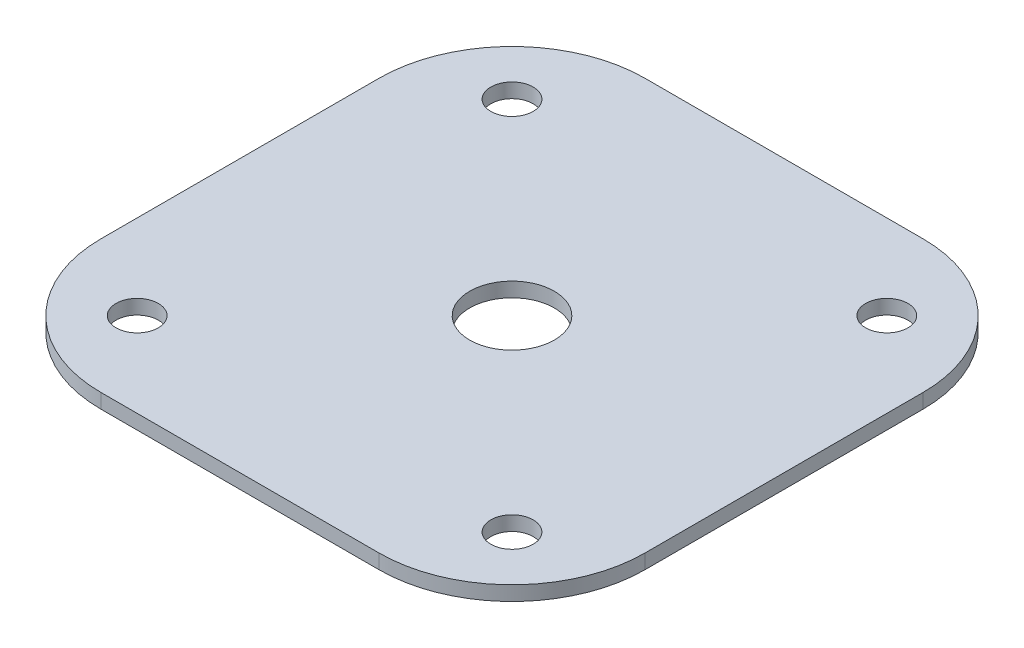
ISO-10303-21;
HEADER;
FILE_DESCRIPTION(('STEP AP214'),'2;1');
FILE_NAME('part.step','',(''),(''),'','','');
FILE_SCHEMA(('AUTOMOTIVE_DESIGN { 1 0 10303 214 1 1 1 1 }'));
ENDSEC;
DATA;
#1=APPLICATION_CONTEXT('core data for automotive mechanical design processes');
#2=APPLICATION_PROTOCOL_DEFINITION('international standard','automotive_design',2000,#1);
#3=PRODUCT_CONTEXT('',#1,'mechanical');
#4=PRODUCT('Part','Part','',(#3));
#5=PRODUCT_RELATED_PRODUCT_CATEGORY('part','',(#4));
#6=PRODUCT_DEFINITION_FORMATION('','',#4);
#7=PRODUCT_DEFINITION_CONTEXT('part definition',#1,'design');
#8=PRODUCT_DEFINITION('design','',#6,#7);
#9=PRODUCT_DEFINITION_SHAPE('','',#8);
#10=(LENGTH_UNIT() NAMED_UNIT(*) SI_UNIT(.MILLI.,.METRE.));
#11=(NAMED_UNIT(*) PLANE_ANGLE_UNIT() SI_UNIT($,.RADIAN.));
#12=(NAMED_UNIT(*) SI_UNIT($,.STERADIAN.) SOLID_ANGLE_UNIT());
#13=UNCERTAINTY_MEASURE_WITH_UNIT(LENGTH_MEASURE(1.E-05),#10,'distance_accuracy_value','');
#14=(GEOMETRIC_REPRESENTATION_CONTEXT(3) GLOBAL_UNCERTAINTY_ASSIGNED_CONTEXT((#13)) GLOBAL_UNIT_ASSIGNED_CONTEXT((#10,
#11,#12)) REPRESENTATION_CONTEXT('',''));
#15=CARTESIAN_POINT('',(0.,0.,0.));
#16=DIRECTION('',(0.,0.,1.));
#17=DIRECTION('',(1.,0.,0.));
#18=AXIS2_PLACEMENT_3D('',#15,#16,#17);
#19=CARTESIAN_POINT('',(-11.5,1.2,11.5));
#20=DIRECTION('',(0.,1.,0.));
#21=DIRECTION('',(0.,0.,1.));
#22=AXIS2_PLACEMENT_3D('',#19,#20,#21);
#23=PLANE('',#22);
#24=CARTESIAN_POINT('',(15.5,1.2,15.5));
#25=DIRECTION('',(0.,1.,0.));
#26=DIRECTION('',(0.,0.,-1.));
#27=AXIS2_PLACEMENT_3D('',#24,#25,#26);
#28=CIRCLE('',#27,1.75);
#29=CARTESIAN_POINT('',(15.5,1.2,13.75));
#30=VERTEX_POINT('',#29);
#31=EDGE_CURVE('E198',#30,#30,#28,.T.);
#32=ORIENTED_EDGE('',*,*,#31,.F.);
#33=EDGE_LOOP('',(#32));
#34=FACE_BOUND('',#33,.T.);
#35=CARTESIAN_POINT('',(-15.5,1.2,-15.5));
#36=DIRECTION('',(0.,1.,0.));
#37=DIRECTION('',(0.,0.,1.));
#38=AXIS2_PLACEMENT_3D('',#35,#36,#37);
#39=CIRCLE('',#38,1.75);
#40=CARTESIAN_POINT('',(-15.5,1.2,-13.75));
#41=VERTEX_POINT('',#40);
#42=EDGE_CURVE('E186',#41,#41,#39,.T.);
#43=ORIENTED_EDGE('',*,*,#42,.F.);
#44=EDGE_LOOP('',(#43));
#45=FACE_BOUND('',#44,.T.);
#46=CARTESIAN_POINT('',(-11.5,1.2,11.5));
#47=DIRECTION('',(0.,1.,0.));
#48=DIRECTION('',(0.,0.,1.));
#49=AXIS2_PLACEMENT_3D('',#46,#47,#48);
#50=CIRCLE('',#49,11.);
#51=CARTESIAN_POINT('',(-22.5,1.2,11.5));
#52=VERTEX_POINT('',#51);
#53=CARTESIAN_POINT('',(-11.5,1.2,22.5));
#54=VERTEX_POINT('',#53);
#55=EDGE_CURVE('E149',#52,#54,#50,.T.);
#56=ORIENTED_EDGE('',*,*,#55,.T.);
#57=DIRECTION('',(1.,0.,0.));
#58=VECTOR('',#57,1.);
#59=CARTESIAN_POINT('',(-11.5,1.2,22.5));
#60=LINE('',#59,#58);
#61=CARTESIAN_POINT('',(11.5,1.2,22.5));
#62=VERTEX_POINT('',#61);
#63=EDGE_CURVE('E97',#54,#62,#60,.T.);
#64=ORIENTED_EDGE('',*,*,#63,.T.);
#65=CARTESIAN_POINT('',(11.5,1.2,11.5));
#66=DIRECTION('',(0.,1.,0.));
#67=DIRECTION('',(0.,0.,1.));
#68=AXIS2_PLACEMENT_3D('',#65,#66,#67);
#69=CIRCLE('',#68,11.);
#70=CARTESIAN_POINT('',(22.5,1.2,11.5));
#71=VERTEX_POINT('',#70);
#72=EDGE_CURVE('E164',#62,#71,#69,.T.);
#73=ORIENTED_EDGE('',*,*,#72,.T.);
#74=DIRECTION('',(0.,0.,-1.));
#75=VECTOR('',#74,1.);
#76=CARTESIAN_POINT('',(22.5,1.2,-11.5));
#77=LINE('',#76,#75);
#78=CARTESIAN_POINT('',(22.5,1.2,-11.5));
#79=VERTEX_POINT('',#78);
#80=EDGE_CURVE('E177',#71,#79,#77,.T.);
#81=ORIENTED_EDGE('',*,*,#80,.T.);
#82=CARTESIAN_POINT('',(11.5,1.2,-11.5));
#83=DIRECTION('',(0.,1.,0.));
#84=DIRECTION('',(0.,0.,-1.));
#85=AXIS2_PLACEMENT_3D('',#82,#83,#84);
#86=CIRCLE('',#85,11.);
#87=CARTESIAN_POINT('',(11.5,1.2,-22.5));
#88=VERTEX_POINT('',#87);
#89=EDGE_CURVE('E116',#79,#88,#86,.T.);
#90=ORIENTED_EDGE('',*,*,#89,.T.);
#91=DIRECTION('',(-1.,0.,0.));
#92=VECTOR('',#91,1.);
#93=CARTESIAN_POINT('',(-11.5,1.2,-22.5));
#94=LINE('',#93,#92);
#95=CARTESIAN_POINT('',(-11.5,1.2,-22.5));
#96=VERTEX_POINT('',#95);
#97=EDGE_CURVE('E110',#88,#96,#94,.T.);
#98=ORIENTED_EDGE('',*,*,#97,.T.);
#99=CARTESIAN_POINT('',(-11.5,1.2,-11.5));
#100=DIRECTION('',(0.,1.,0.));
#101=DIRECTION('',(0.,0.,1.));
#102=AXIS2_PLACEMENT_3D('',#99,#100,#101);
#103=CIRCLE('',#102,11.);
#104=CARTESIAN_POINT('',(-22.5,1.2,-11.5));
#105=VERTEX_POINT('',#104);
#106=EDGE_CURVE('E114',#96,#105,#103,.T.);
#107=ORIENTED_EDGE('',*,*,#106,.T.);
#108=DIRECTION('',(0.,0.,1.));
#109=VECTOR('',#108,1.);
#110=CARTESIAN_POINT('',(-22.5,1.2,-11.5));
#111=LINE('',#110,#109);
#112=EDGE_CURVE('E54',#105,#52,#111,.T.);
#113=ORIENTED_EDGE('',*,*,#112,.T.);
#114=EDGE_LOOP('',(#56,#64,#73,#81,#90,#98,#107,#113));
#115=FACE_BOUND('',#114,.T.);
#116=CARTESIAN_POINT('',(0.,1.2,0.));
#117=DIRECTION('',(0.,1.,0.));
#118=DIRECTION('',(0.,0.,1.));
#119=AXIS2_PLACEMENT_3D('',#116,#117,#118);
#120=CIRCLE('',#119,3.5);
#121=CARTESIAN_POINT('',(0.,1.2,3.5));
#122=VERTEX_POINT('',#121);
#123=EDGE_CURVE('E138',#122,#122,#120,.T.);
#124=ORIENTED_EDGE('',*,*,#123,.F.);
#125=EDGE_LOOP('',(#124));
#126=FACE_BOUND('',#125,.T.);
#127=CARTESIAN_POINT('',(15.5,1.2,-15.5));
#128=DIRECTION('',(0.,1.,0.));
#129=DIRECTION('',(0.,0.,1.));
#130=AXIS2_PLACEMENT_3D('',#127,#128,#129);
#131=CIRCLE('',#130,1.75);
#132=CARTESIAN_POINT('',(15.5,1.2,-13.75));
#133=VERTEX_POINT('',#132);
#134=EDGE_CURVE('E192',#133,#133,#131,.T.);
#135=ORIENTED_EDGE('',*,*,#134,.F.);
#136=EDGE_LOOP('',(#135));
#137=FACE_BOUND('',#136,.T.);
#138=CARTESIAN_POINT('',(-15.5,1.2,15.5));
#139=DIRECTION('',(0.,1.,0.));
#140=DIRECTION('',(0.,0.,-1.));
#141=AXIS2_PLACEMENT_3D('',#138,#139,#140);
#142=CIRCLE('',#141,1.75);
#143=CARTESIAN_POINT('',(-15.5,1.2,13.75));
#144=VERTEX_POINT('',#143);
#145=EDGE_CURVE('E204',#144,#144,#142,.T.);
#146=ORIENTED_EDGE('',*,*,#145,.F.);
#147=EDGE_LOOP('',(#146));
#148=FACE_BOUND('',#147,.T.);
#149=ADVANCED_FACE('F37',(#34,#45,#115,#126,#137,#148),#23,.T.);
#150=CARTESIAN_POINT('',(-11.5,0.,11.5));
#151=DIRECTION('',(0.,1.,0.));
#152=DIRECTION('',(0.,0.,1.));
#153=AXIS2_PLACEMENT_3D('',#150,#151,#152);
#154=PLANE('',#153);
#155=CARTESIAN_POINT('',(-11.5,0.,11.5));
#156=DIRECTION('',(0.,1.,0.));
#157=DIRECTION('',(0.,0.,1.));
#158=AXIS2_PLACEMENT_3D('',#155,#156,#157);
#159=CIRCLE('',#158,11.);
#160=CARTESIAN_POINT('',(-22.5,0.,11.5));
#161=VERTEX_POINT('',#160);
#162=CARTESIAN_POINT('',(-11.5,0.,22.5));
#163=VERTEX_POINT('',#162);
#164=EDGE_CURVE('E134',#161,#163,#159,.T.);
#165=ORIENTED_EDGE('',*,*,#164,.F.);
#166=DIRECTION('',(0.,0.,1.));
#167=VECTOR('',#166,1.);
#168=CARTESIAN_POINT('',(-22.5,0.,-11.5));
#169=LINE('',#168,#167);
#170=CARTESIAN_POINT('',(-22.5,0.,-11.5));
#171=VERTEX_POINT('',#170);
#172=EDGE_CURVE('E89',#171,#161,#169,.T.);
#173=ORIENTED_EDGE('',*,*,#172,.F.);
#174=CARTESIAN_POINT('',(-11.5,0.,-11.5));
#175=DIRECTION('',(0.,1.,0.));
#176=DIRECTION('',(0.,0.,1.));
#177=AXIS2_PLACEMENT_3D('',#174,#175,#176);
#178=CIRCLE('',#177,11.);
#179=CARTESIAN_POINT('',(-11.5,0.,-22.5));
#180=VERTEX_POINT('',#179);
#181=EDGE_CURVE('E83',#180,#171,#178,.T.);
#182=ORIENTED_EDGE('',*,*,#181,.F.);
#183=DIRECTION('',(-1.,0.,0.));
#184=VECTOR('',#183,1.);
#185=CARTESIAN_POINT('',(-11.5,0.,-22.5));
#186=LINE('',#185,#184);
#187=CARTESIAN_POINT('',(11.5,0.,-22.5));
#188=VERTEX_POINT('',#187);
#189=EDGE_CURVE('E124',#188,#180,#186,.T.);
#190=ORIENTED_EDGE('',*,*,#189,.F.);
#191=CARTESIAN_POINT('',(11.5,0.,-11.5));
#192=DIRECTION('',(0.,1.,0.));
#193=DIRECTION('',(0.,0.,-1.));
#194=AXIS2_PLACEMENT_3D('',#191,#192,#193);
#195=CIRCLE('',#194,11.);
#196=CARTESIAN_POINT('',(22.5,0.,-11.5));
#197=VERTEX_POINT('',#196);
#198=EDGE_CURVE('E144',#197,#188,#195,.T.);
#199=ORIENTED_EDGE('',*,*,#198,.F.);
#200=DIRECTION('',(0.,0.,-1.));
#201=VECTOR('',#200,1.);
#202=CARTESIAN_POINT('',(22.5,0.,-11.5));
#203=LINE('',#202,#201);
#204=CARTESIAN_POINT('',(22.5,0.,11.5));
#205=VERTEX_POINT('',#204);
#206=EDGE_CURVE('E142',#205,#197,#203,.T.);
#207=ORIENTED_EDGE('',*,*,#206,.F.);
#208=CARTESIAN_POINT('',(11.5,0.,11.5));
#209=DIRECTION('',(0.,1.,0.));
#210=DIRECTION('',(0.,0.,1.));
#211=AXIS2_PLACEMENT_3D('',#208,#209,#210);
#212=CIRCLE('',#211,11.);
#213=CARTESIAN_POINT('',(11.5,0.,22.5));
#214=VERTEX_POINT('',#213);
#215=EDGE_CURVE('E140',#214,#205,#212,.T.);
#216=ORIENTED_EDGE('',*,*,#215,.F.);
#217=DIRECTION('',(1.,0.,0.));
#218=VECTOR('',#217,1.);
#219=CARTESIAN_POINT('',(-11.5,0.,22.5));
#220=LINE('',#219,#218);
#221=EDGE_CURVE('E137',#163,#214,#220,.T.);
#222=ORIENTED_EDGE('',*,*,#221,.F.);
#223=EDGE_LOOP('',(#165,#173,#182,#190,#199,#207,#216,#222));
#224=FACE_BOUND('',#223,.T.);
#225=CARTESIAN_POINT('',(0.,0.,0.));
#226=DIRECTION('',(0.,1.,0.));
#227=DIRECTION('',(0.,0.,1.));
#228=AXIS2_PLACEMENT_3D('',#225,#226,#227);
#229=CIRCLE('',#228,3.5);
#230=CARTESIAN_POINT('',(0.,0.,3.5));
#231=VERTEX_POINT('',#230);
#232=EDGE_CURVE('E183',#231,#231,#229,.T.);
#233=ORIENTED_EDGE('',*,*,#232,.T.);
#234=EDGE_LOOP('',(#233));
#235=FACE_BOUND('',#234,.T.);
#236=CARTESIAN_POINT('',(-15.5,0.,-15.5));
#237=DIRECTION('',(0.,1.,0.));
#238=DIRECTION('',(0.,0.,1.));
#239=AXIS2_PLACEMENT_3D('',#236,#237,#238);
#240=CIRCLE('',#239,1.75);
#241=CARTESIAN_POINT('',(-15.5,0.,-13.75));
#242=VERTEX_POINT('',#241);
#243=EDGE_CURVE('E189',#242,#242,#240,.T.);
#244=ORIENTED_EDGE('',*,*,#243,.T.);
#245=EDGE_LOOP('',(#244));
#246=FACE_BOUND('',#245,.T.);
#247=CARTESIAN_POINT('',(15.5,0.,-15.5));
#248=DIRECTION('',(0.,1.,0.));
#249=DIRECTION('',(0.,0.,1.));
#250=AXIS2_PLACEMENT_3D('',#247,#248,#249);
#251=CIRCLE('',#250,1.75);
#252=CARTESIAN_POINT('',(15.5,0.,-13.75));
#253=VERTEX_POINT('',#252);
#254=EDGE_CURVE('E195',#253,#253,#251,.T.);
#255=ORIENTED_EDGE('',*,*,#254,.T.);
#256=EDGE_LOOP('',(#255));
#257=FACE_BOUND('',#256,.T.);
#258=CARTESIAN_POINT('',(15.5,0.,15.5));
#259=DIRECTION('',(0.,1.,0.));
#260=DIRECTION('',(0.,0.,-1.));
#261=AXIS2_PLACEMENT_3D('',#258,#259,#260);
#262=CIRCLE('',#261,1.75);
#263=CARTESIAN_POINT('',(15.5,0.,13.75));
#264=VERTEX_POINT('',#263);
#265=EDGE_CURVE('E201',#264,#264,#262,.T.);
#266=ORIENTED_EDGE('',*,*,#265,.T.);
#267=EDGE_LOOP('',(#266));
#268=FACE_BOUND('',#267,.T.);
#269=CARTESIAN_POINT('',(-15.5,0.,15.5));
#270=DIRECTION('',(0.,1.,0.));
#271=DIRECTION('',(0.,0.,-1.));
#272=AXIS2_PLACEMENT_3D('',#269,#270,#271);
#273=CIRCLE('',#272,1.75);
#274=CARTESIAN_POINT('',(-15.5,0.,13.75));
#275=VERTEX_POINT('',#274);
#276=EDGE_CURVE('E207',#275,#275,#273,.T.);
#277=ORIENTED_EDGE('',*,*,#276,.T.);
#278=EDGE_LOOP('',(#277));
#279=FACE_BOUND('',#278,.T.);
#280=ADVANCED_FACE('F168',(#224,#235,#246,#257,#268,#279),#154,.F.);
#281=CARTESIAN_POINT('',(-11.5,1.2,11.5));
#282=DIRECTION('',(0.,-1.,0.));
#283=DIRECTION('',(0.,0.,-1.));
#284=AXIS2_PLACEMENT_3D('',#281,#282,#283);
#285=CYLINDRICAL_SURFACE('',#284,11.);
#286=ORIENTED_EDGE('',*,*,#164,.T.);
#287=DIRECTION('',(0.,-1.,0.));
#288=VECTOR('',#287,1.);
#289=CARTESIAN_POINT('',(-11.5,1.2,22.5));
#290=LINE('',#289,#288);
#291=EDGE_CURVE('E11',#54,#163,#290,.T.);
#292=ORIENTED_EDGE('',*,*,#291,.F.);
#293=ORIENTED_EDGE('',*,*,#55,.F.);
#294=DIRECTION('',(0.,-1.,0.));
#295=VECTOR('',#294,1.);
#296=CARTESIAN_POINT('',(-22.5,1.2,11.5));
#297=LINE('',#296,#295);
#298=EDGE_CURVE('E130',#52,#161,#297,.T.);
#299=ORIENTED_EDGE('',*,*,#298,.T.);
#300=EDGE_LOOP('',(#286,#292,#293,#299));
#301=FACE_BOUND('',#300,.T.);
#302=ADVANCED_FACE('F39',(#301),#285,.T.);
#303=CARTESIAN_POINT('',(-11.5,1.2,22.5));
#304=DIRECTION('',(0.,0.,-1.));
#305=DIRECTION('',(-1.,0.,0.));
#306=AXIS2_PLACEMENT_3D('',#303,#304,#305);
#307=PLANE('',#306);
#308=ORIENTED_EDGE('',*,*,#221,.T.);
#309=DIRECTION('',(0.,-1.,0.));
#310=VECTOR('',#309,1.);
#311=CARTESIAN_POINT('',(11.5,1.2,22.5));
#312=LINE('',#311,#310);
#313=EDGE_CURVE('E46',#62,#214,#312,.T.);
#314=ORIENTED_EDGE('',*,*,#313,.F.);
#315=ORIENTED_EDGE('',*,*,#63,.F.);
#316=ORIENTED_EDGE('',*,*,#291,.T.);
#317=EDGE_LOOP('',(#308,#314,#315,#316));
#318=FACE_BOUND('',#317,.T.);
#319=ADVANCED_FACE('F241',(#318),#307,.F.);
#320=CARTESIAN_POINT('',(11.5,1.2,11.5));
#321=DIRECTION('',(0.,-1.,0.));
#322=DIRECTION('',(0.,0.,-1.));
#323=AXIS2_PLACEMENT_3D('',#320,#321,#322);
#324=CYLINDRICAL_SURFACE('',#323,11.);
#325=ORIENTED_EDGE('',*,*,#215,.T.);
#326=DIRECTION('',(0.,-1.,0.));
#327=VECTOR('',#326,1.);
#328=CARTESIAN_POINT('',(22.5,1.2,11.5));
#329=LINE('',#328,#327);
#330=EDGE_CURVE('E156',#71,#205,#329,.T.);
#331=ORIENTED_EDGE('',*,*,#330,.F.);
#332=ORIENTED_EDGE('',*,*,#72,.F.);
#333=ORIENTED_EDGE('',*,*,#313,.T.);
#334=EDGE_LOOP('',(#325,#331,#332,#333));
#335=FACE_BOUND('',#334,.T.);
#336=ADVANCED_FACE('F162',(#335),#324,.T.);
#337=CARTESIAN_POINT('',(22.5,1.2,-11.5));
#338=DIRECTION('',(-1.,0.,0.));
#339=DIRECTION('',(0.,0.,1.));
#340=AXIS2_PLACEMENT_3D('',#337,#338,#339);
#341=PLANE('',#340);
#342=ORIENTED_EDGE('',*,*,#206,.T.);
#343=DIRECTION('',(0.,-1.,0.));
#344=VECTOR('',#343,1.);
#345=CARTESIAN_POINT('',(22.5,1.2,-11.5));
#346=LINE('',#345,#344);
#347=EDGE_CURVE('E153',#79,#197,#346,.T.);
#348=ORIENTED_EDGE('',*,*,#347,.F.);
#349=ORIENTED_EDGE('',*,*,#80,.F.);
#350=ORIENTED_EDGE('',*,*,#330,.T.);
#351=EDGE_LOOP('',(#342,#348,#349,#350));
#352=FACE_BOUND('',#351,.T.);
#353=ADVANCED_FACE('F173',(#352),#341,.F.);
#354=CARTESIAN_POINT('',(11.5,1.2,-11.5));
#355=DIRECTION('',(0.,-1.,0.));
#356=DIRECTION('',(0.,0.,-1.));
#357=AXIS2_PLACEMENT_3D('',#354,#355,#356);
#358=CYLINDRICAL_SURFACE('',#357,11.);
#359=ORIENTED_EDGE('',*,*,#198,.T.);
#360=DIRECTION('',(0.,-1.,0.));
#361=VECTOR('',#360,1.);
#362=CARTESIAN_POINT('',(11.5,1.2,-22.5));
#363=LINE('',#362,#361);
#364=EDGE_CURVE('E125',#88,#188,#363,.T.);
#365=ORIENTED_EDGE('',*,*,#364,.F.);
#366=ORIENTED_EDGE('',*,*,#89,.F.);
#367=ORIENTED_EDGE('',*,*,#347,.T.);
#368=EDGE_LOOP('',(#359,#365,#366,#367));
#369=FACE_BOUND('',#368,.T.);
#370=ADVANCED_FACE('F176',(#369),#358,.T.);
#371=CARTESIAN_POINT('',(-11.5,1.2,-22.5));
#372=DIRECTION('',(0.,0.,1.));
#373=DIRECTION('',(1.,0.,0.));
#374=AXIS2_PLACEMENT_3D('',#371,#372,#373);
#375=PLANE('',#374);
#376=ORIENTED_EDGE('',*,*,#189,.T.);
#377=DIRECTION('',(0.,-1.,0.));
#378=VECTOR('',#377,1.);
#379=CARTESIAN_POINT('',(-11.5,1.2,-22.5));
#380=LINE('',#379,#378);
#381=EDGE_CURVE('E121',#96,#180,#380,.T.);
#382=ORIENTED_EDGE('',*,*,#381,.F.);
#383=ORIENTED_EDGE('',*,*,#97,.F.);
#384=ORIENTED_EDGE('',*,*,#364,.T.);
#385=EDGE_LOOP('',(#376,#382,#383,#384));
#386=FACE_BOUND('',#385,.T.);
#387=ADVANCED_FACE('F122',(#386),#375,.F.);
#388=CARTESIAN_POINT('',(-11.5,1.2,-11.5));
#389=DIRECTION('',(0.,-1.,0.));
#390=DIRECTION('',(0.,0.,-1.));
#391=AXIS2_PLACEMENT_3D('',#388,#389,#390);
#392=CYLINDRICAL_SURFACE('',#391,11.);
#393=ORIENTED_EDGE('',*,*,#181,.T.);
#394=DIRECTION('',(0.,-1.,0.));
#395=VECTOR('',#394,1.);
#396=CARTESIAN_POINT('',(-22.5,1.2,-11.5));
#397=LINE('',#396,#395);
#398=EDGE_CURVE('E126',#105,#171,#397,.T.);
#399=ORIENTED_EDGE('',*,*,#398,.F.);
#400=ORIENTED_EDGE('',*,*,#106,.F.);
#401=ORIENTED_EDGE('',*,*,#381,.T.);
#402=EDGE_LOOP('',(#393,#399,#400,#401));
#403=FACE_BOUND('',#402,.T.);
#404=ADVANCED_FACE('F128',(#403),#392,.T.);
#405=CARTESIAN_POINT('',(-22.5,1.2,-11.5));
#406=DIRECTION('',(1.,0.,0.));
#407=DIRECTION('',(0.,0.,-1.));
#408=AXIS2_PLACEMENT_3D('',#405,#406,#407);
#409=PLANE('',#408);
#410=ORIENTED_EDGE('',*,*,#172,.T.);
#411=ORIENTED_EDGE('',*,*,#298,.F.);
#412=ORIENTED_EDGE('',*,*,#112,.F.);
#413=ORIENTED_EDGE('',*,*,#398,.T.);
#414=EDGE_LOOP('',(#410,#411,#412,#413));
#415=FACE_BOUND('',#414,.T.);
#416=ADVANCED_FACE('F229',(#415),#409,.F.);
#417=CARTESIAN_POINT('',(0.,1.2,0.));
#418=DIRECTION('',(0.,-1.,0.));
#419=DIRECTION('',(0.,0.,-1.));
#420=AXIS2_PLACEMENT_3D('',#417,#418,#419);
#421=CYLINDRICAL_SURFACE('',#420,3.5);
#422=ORIENTED_EDGE('',*,*,#123,.T.);
#423=EDGE_LOOP('',(#422));
#424=FACE_BOUND('',#423,.T.);
#425=ORIENTED_EDGE('',*,*,#232,.F.);
#426=EDGE_LOOP('',(#425));
#427=FACE_BOUND('',#426,.T.);
#428=ADVANCED_FACE('F226',(#424,#427),#421,.F.);
#429=CARTESIAN_POINT('',(-15.5,1.2,-15.5));
#430=DIRECTION('',(0.,-1.,0.));
#431=DIRECTION('',(0.,0.,-1.));
#432=AXIS2_PLACEMENT_3D('',#429,#430,#431);
#433=CYLINDRICAL_SURFACE('',#432,1.75);
#434=ORIENTED_EDGE('',*,*,#42,.T.);
#435=EDGE_LOOP('',(#434));
#436=FACE_BOUND('',#435,.T.);
#437=ORIENTED_EDGE('',*,*,#243,.F.);
#438=EDGE_LOOP('',(#437));
#439=FACE_BOUND('',#438,.T.);
#440=ADVANCED_FACE('F305',(#436,#439),#433,.F.);
#441=CARTESIAN_POINT('',(15.5,1.2,-15.5));
#442=DIRECTION('',(0.,-1.,0.));
#443=DIRECTION('',(0.,0.,-1.));
#444=AXIS2_PLACEMENT_3D('',#441,#442,#443);
#445=CYLINDRICAL_SURFACE('',#444,1.75);
#446=ORIENTED_EDGE('',*,*,#134,.T.);
#447=EDGE_LOOP('',(#446));
#448=FACE_BOUND('',#447,.T.);
#449=ORIENTED_EDGE('',*,*,#254,.F.);
#450=EDGE_LOOP('',(#449));
#451=FACE_BOUND('',#450,.T.);
#452=ADVANCED_FACE('F313',(#448,#451),#445,.F.);
#453=CARTESIAN_POINT('',(15.5,1.2,15.5));
#454=DIRECTION('',(0.,-1.,0.));
#455=DIRECTION('',(0.,0.,-1.));
#456=AXIS2_PLACEMENT_3D('',#453,#454,#455);
#457=CYLINDRICAL_SURFACE('',#456,1.75);
#458=ORIENTED_EDGE('',*,*,#31,.T.);
#459=EDGE_LOOP('',(#458));
#460=FACE_BOUND('',#459,.T.);
#461=ORIENTED_EDGE('',*,*,#265,.F.);
#462=EDGE_LOOP('',(#461));
#463=FACE_BOUND('',#462,.T.);
#464=ADVANCED_FACE('F321',(#460,#463),#457,.F.);
#465=CARTESIAN_POINT('',(-15.5,1.2,15.5));
#466=DIRECTION('',(0.,-1.,0.));
#467=DIRECTION('',(0.,0.,-1.));
#468=AXIS2_PLACEMENT_3D('',#465,#466,#467);
#469=CYLINDRICAL_SURFACE('',#468,1.75);
#470=ORIENTED_EDGE('',*,*,#145,.T.);
#471=EDGE_LOOP('',(#470));
#472=FACE_BOUND('',#471,.T.);
#473=ORIENTED_EDGE('',*,*,#276,.F.);
#474=EDGE_LOOP('',(#473));
#475=FACE_BOUND('',#474,.T.);
#476=ADVANCED_FACE('F213',(#472,#475),#469,.F.);
#477=CLOSED_SHELL('',(#149,#280,#302,#319,#336,#353,#370,#387,#404,#416,#428,#440,#452,#464,#476));
#478=MANIFOLD_SOLID_BREP('B2',#477);
#479=ADVANCED_BREP_SHAPE_REPRESENTATION('',(#18,#478),#14);
#480=SHAPE_DEFINITION_REPRESENTATION(#9,#479);
ENDSEC;
END-ISO-10303-21;
